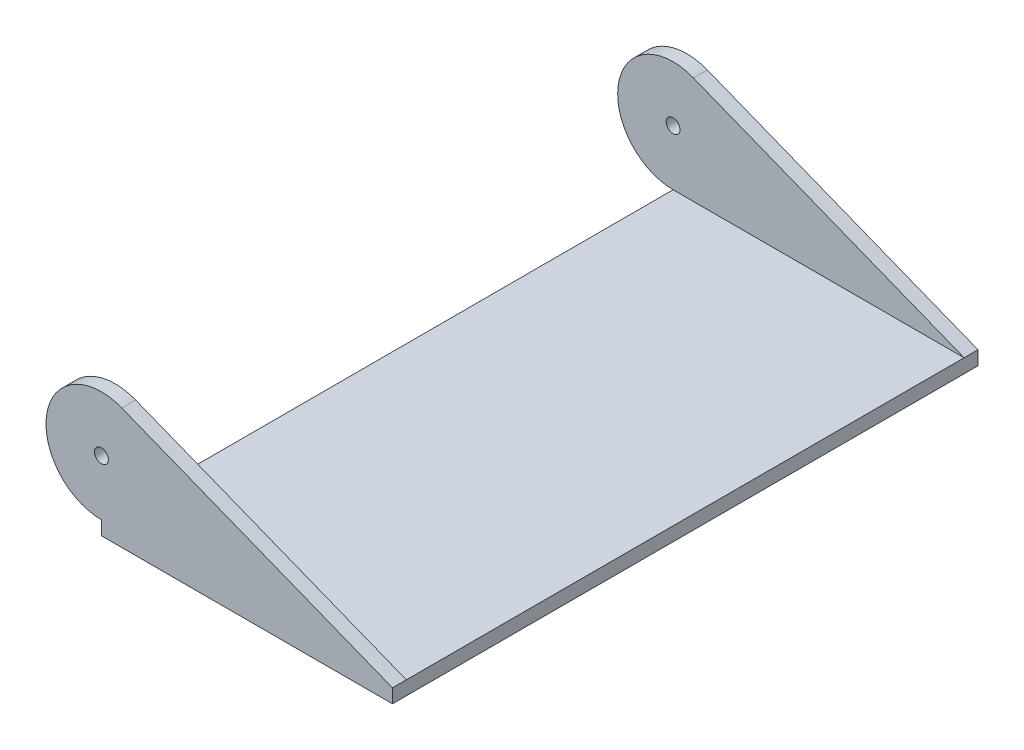
ISO-10303-21;
HEADER;
FILE_DESCRIPTION(('STEP AP214'),'2;1');
FILE_NAME('part.step','',(''),(''),'','','');
FILE_SCHEMA(('AUTOMOTIVE_DESIGN { 1 0 10303 214 1 1 1 1 }'));
ENDSEC;
DATA;
#1=APPLICATION_CONTEXT('core data for automotive mechanical design processes');
#2=APPLICATION_PROTOCOL_DEFINITION('international standard','automotive_design',2000,#1);
#3=PRODUCT_CONTEXT('',#1,'mechanical');
#4=PRODUCT('Part','Part','',(#3));
#5=PRODUCT_RELATED_PRODUCT_CATEGORY('part','',(#4));
#6=PRODUCT_DEFINITION_FORMATION('','',#4);
#7=PRODUCT_DEFINITION_CONTEXT('part definition',#1,'design');
#8=PRODUCT_DEFINITION('design','',#6,#7);
#9=PRODUCT_DEFINITION_SHAPE('','',#8);
#10=(LENGTH_UNIT() NAMED_UNIT(*) SI_UNIT(.MILLI.,.METRE.));
#11=(NAMED_UNIT(*) PLANE_ANGLE_UNIT() SI_UNIT($,.RADIAN.));
#12=(NAMED_UNIT(*) SI_UNIT($,.STERADIAN.) SOLID_ANGLE_UNIT());
#13=UNCERTAINTY_MEASURE_WITH_UNIT(LENGTH_MEASURE(1.E-05),#10,'distance_accuracy_value','');
#14=(GEOMETRIC_REPRESENTATION_CONTEXT(3) GLOBAL_UNCERTAINTY_ASSIGNED_CONTEXT((#13)) GLOBAL_UNIT_ASSIGNED_CONTEXT((#10,
#11,#12)) REPRESENTATION_CONTEXT('',''));
#15=CARTESIAN_POINT('',(0.,0.,0.));
#16=DIRECTION('',(0.,0.,1.));
#17=DIRECTION('',(1.,0.,0.));
#18=AXIS2_PLACEMENT_3D('',#15,#16,#17);
#19=CARTESIAN_POINT('',(1.63802124980249,4.14380375694082,-126.003723502117));
#20=DIRECTION('',(0.367614879649891,0.929978118161926,0.));
#21=DIRECTION('',(-0.929978118161926,0.367614879649891,0.));
#22=AXIS2_PLACEMENT_3D('',#19,#20,#21);
#23=PLANE('',#22);
#24=DIRECTION('',(0.929978118161926,-0.367614879649891,0.));
#25=VECTOR('',#24,1.);
#26=CARTESIAN_POINT('',(1.63802124980248,4.14380375694082,-18.8493634259259));
#27=LINE('',#26,#25);
#28=CARTESIAN_POINT('',(-22.8982844031121,13.8428610503282,-18.8493634259259));
#29=VERTEX_POINT('',#28);
#30=CARTESIAN_POINT('',(8.10486111111111,1.5875,-18.8493634259259));
#31=VERTEX_POINT('',#30);
#32=EDGE_CURVE('E135',#29,#31,#27,.T.);
#33=ORIENTED_EDGE('',*,*,#32,.F.);
#34=DIRECTION('',(0.,0.,1.));
#35=VECTOR('',#34,1.);
#36=CARTESIAN_POINT('',(-22.8982844031121,13.8428610503282,-126.003723502117));
#37=LINE('',#36,#35);
#38=CARTESIAN_POINT('',(-22.8982844031121,13.8428610503282,-17.2618634259259));
#39=VERTEX_POINT('',#38);
#40=EDGE_CURVE('E153',#29,#39,#37,.T.);
#41=ORIENTED_EDGE('',*,*,#40,.T.);
#42=DIRECTION('',(-0.929978118161926,0.367614879649891,0.));
#43=VECTOR('',#42,1.);
#44=CARTESIAN_POINT('',(1.63802124980249,4.14380375694082,-17.2618634259259));
#45=LINE('',#44,#43);
#46=CARTESIAN_POINT('',(8.10486111111111,1.5875,-17.2618634259259));
#47=VERTEX_POINT('',#46);
#48=EDGE_CURVE('E142',#47,#39,#45,.T.);
#49=ORIENTED_EDGE('',*,*,#48,.F.);
#50=DIRECTION('',(0.,0.,1.));
#51=VECTOR('',#50,1.);
#52=CARTESIAN_POINT('',(8.10486111111111,1.5875,-84.3337384259259));
#53=LINE('',#52,#51);
#54=EDGE_CURVE('E89',#31,#47,#53,.T.);
#55=ORIENTED_EDGE('',*,*,#54,.F.);
#56=EDGE_LOOP('',(#33,#41,#49,#55));
#57=FACE_BOUND('',#56,.T.);
#58=ADVANCED_FACE('F35',(#57),#23,.T.);
#59=CARTESIAN_POINT('',(-25.2326388888889,7.9375,-126.003723502117));
#60=DIRECTION('',(0.,0.,1.));
#61=DIRECTION('',(1.,0.,0.));
#62=AXIS2_PLACEMENT_3D('',#59,#60,#61);
#63=CYLINDRICAL_SURFACE('',#62,6.35);
#64=CARTESIAN_POINT('',(-25.2326388888889,7.9375,-18.8493634259259));
#65=DIRECTION('',(0.,0.,1.));
#66=DIRECTION('',(0.,-1.,0.));
#67=AXIS2_PLACEMENT_3D('',#64,#65,#66);
#68=CIRCLE('',#67,6.35);
#69=CARTESIAN_POINT('',(-25.2326388888889,1.5875,-18.8493634259259));
#70=VERTEX_POINT('',#69);
#71=EDGE_CURVE('E132',#70,#29,#68,.F.);
#72=ORIENTED_EDGE('',*,*,#71,.F.);
#73=DIRECTION('',(0.,0.,1.));
#74=VECTOR('',#73,1.);
#75=CARTESIAN_POINT('',(-25.2326388888889,1.5875,-84.3337384259259));
#76=LINE('',#75,#74);
#77=CARTESIAN_POINT('',(-25.2326388888889,1.5875,-17.2618634259259));
#78=VERTEX_POINT('',#77);
#79=EDGE_CURVE('E157',#70,#78,#76,.T.);
#80=ORIENTED_EDGE('',*,*,#79,.T.);
#81=CARTESIAN_POINT('',(-25.2326388888889,7.9375,-17.2618634259259));
#82=DIRECTION('',(0.,0.,1.));
#83=DIRECTION('',(1.,0.,0.));
#84=AXIS2_PLACEMENT_3D('',#81,#82,#83);
#85=CIRCLE('',#84,6.35);
#86=EDGE_CURVE('E101',#39,#78,#85,.T.);
#87=ORIENTED_EDGE('',*,*,#86,.F.);
#88=ORIENTED_EDGE('',*,*,#40,.F.);
#89=EDGE_LOOP('',(#72,#80,#87,#88));
#90=FACE_BOUND('',#89,.T.);
#91=ADVANCED_FACE('F200',(#90),#63,.T.);
#92=CARTESIAN_POINT('',(-25.2326388888889,7.9375,-126.003723502117));
#93=DIRECTION('',(0.,0.,1.));
#94=DIRECTION('',(1.,0.,0.));
#95=AXIS2_PLACEMENT_3D('',#92,#93,#94);
#96=CYLINDRICAL_SURFACE('',#95,0.793749999999999);
#97=CARTESIAN_POINT('',(-25.2326388888889,7.9375,-18.8493634259259));
#98=DIRECTION('',(0.,0.,1.));
#99=DIRECTION('',(0.,-1.,0.));
#100=AXIS2_PLACEMENT_3D('',#97,#98,#99);
#101=CIRCLE('',#100,0.793749999999999);
#102=CARTESIAN_POINT('',(-25.2326388888889,7.14375,-18.8493634259259));
#103=VERTEX_POINT('',#102);
#104=EDGE_CURVE('E39',#103,#103,#101,.F.);
#105=ORIENTED_EDGE('',*,*,#104,.T.);
#106=EDGE_LOOP('',(#105));
#107=FACE_BOUND('',#106,.T.);
#108=CARTESIAN_POINT('',(-25.2326388888889,7.9375,-17.2618634259259));
#109=DIRECTION('',(0.,0.,1.));
#110=DIRECTION('',(1.,0.,0.));
#111=AXIS2_PLACEMENT_3D('',#108,#109,#110);
#112=CIRCLE('',#111,0.793749999999999);
#113=CARTESIAN_POINT('',(-24.4388888888889,7.9375,-17.2618634259259));
#114=VERTEX_POINT('',#113);
#115=EDGE_CURVE('E139',#114,#114,#112,.T.);
#116=ORIENTED_EDGE('',*,*,#115,.T.);
#117=EDGE_LOOP('',(#116));
#118=FACE_BOUND('',#117,.T.);
#119=ADVANCED_FACE('F219',(#107,#118),#96,.F.);
#120=CARTESIAN_POINT('',(-25.2326388888889,1.5875,-84.3337384259259));
#121=DIRECTION('',(0.,0.,-1.));
#122=DIRECTION('',(-1.,0.,0.));
#123=AXIS2_PLACEMENT_3D('',#120,#121,#122);
#124=PLANE('',#123);
#125=DIRECTION('',(1.,0.,0.));
#126=VECTOR('',#125,1.);
#127=CARTESIAN_POINT('',(-25.2326388888889,0.,-84.3337384259259));
#128=LINE('',#127,#126);
#129=CARTESIAN_POINT('',(-25.2326388888889,0.,-84.3337384259259));
#130=VERTEX_POINT('',#129);
#131=CARTESIAN_POINT('',(8.10486111111111,0.,-84.3337384259259));
#132=VERTEX_POINT('',#131);
#133=EDGE_CURVE('E108',#130,#132,#128,.T.);
#134=ORIENTED_EDGE('',*,*,#133,.F.);
#135=DIRECTION('',(0.,-1.,0.));
#136=VECTOR('',#135,1.);
#137=CARTESIAN_POINT('',(-25.2326388888889,1.5875,-84.3337384259259));
#138=LINE('',#137,#136);
#139=CARTESIAN_POINT('',(-25.2326388888889,1.5875,-84.3337384259259));
#140=VERTEX_POINT('',#139);
#141=EDGE_CURVE('E11',#140,#130,#138,.T.);
#142=ORIENTED_EDGE('',*,*,#141,.F.);
#143=CARTESIAN_POINT('',(-25.2326388888889,7.9375,-84.3337384259259));
#144=DIRECTION('',(0.,0.,-1.));
#145=DIRECTION('',(-1.,0.,0.));
#146=AXIS2_PLACEMENT_3D('',#143,#144,#145);
#147=CIRCLE('',#146,6.35);
#148=CARTESIAN_POINT('',(-22.8982844031121,13.8428610503282,-84.3337384259259));
#149=VERTEX_POINT('',#148);
#150=EDGE_CURVE('E143',#149,#140,#147,.F.);
#151=ORIENTED_EDGE('',*,*,#150,.F.);
#152=DIRECTION('',(-0.929978118161926,0.367614879649891,0.));
#153=VECTOR('',#152,1.);
#154=CARTESIAN_POINT('',(1.63802124980249,4.14380375694082,-84.3337384259259));
#155=LINE('',#154,#153);
#156=CARTESIAN_POINT('',(8.10486111111111,1.5875,-84.3337384259259));
#157=VERTEX_POINT('',#156);
#158=EDGE_CURVE('E138',#157,#149,#155,.T.);
#159=ORIENTED_EDGE('',*,*,#158,.F.);
#160=DIRECTION('',(0.,-1.,0.));
#161=VECTOR('',#160,1.);
#162=CARTESIAN_POINT('',(8.10486111111111,1.5875,-84.3337384259259));
#163=LINE('',#162,#161);
#164=EDGE_CURVE('E113',#157,#132,#163,.T.);
#165=ORIENTED_EDGE('',*,*,#164,.T.);
#166=EDGE_LOOP('',(#134,#142,#151,#159,#165));
#167=FACE_BOUND('',#166,.T.);
#168=CARTESIAN_POINT('',(-25.2326388888889,7.9375,-84.3337384259259));
#169=DIRECTION('',(0.,0.,-1.));
#170=DIRECTION('',(-1.,0.,0.));
#171=AXIS2_PLACEMENT_3D('',#168,#169,#170);
#172=CIRCLE('',#171,0.793749999999999);
#173=CARTESIAN_POINT('',(-26.0263888888889,7.9375,-84.3337384259259));
#174=VERTEX_POINT('',#173);
#175=EDGE_CURVE('E145',#174,#174,#172,.F.);
#176=ORIENTED_EDGE('',*,*,#175,.T.);
#177=EDGE_LOOP('',(#176));
#178=FACE_BOUND('',#177,.T.);
#179=ADVANCED_FACE('F37',(#167,#178),#124,.T.);
#180=CARTESIAN_POINT('',(-25.2326388888889,1.5875,-84.3337384259259));
#181=DIRECTION('',(1.,0.,0.));
#182=DIRECTION('',(0.,0.,-1.));
#183=AXIS2_PLACEMENT_3D('',#180,#181,#182);
#184=PLANE('',#183);
#185=DIRECTION('',(0.,0.,1.));
#186=VECTOR('',#185,1.);
#187=CARTESIAN_POINT('',(-25.2326388888889,0.,-84.3337384259259));
#188=LINE('',#187,#186);
#189=CARTESIAN_POINT('',(-25.2326388888889,0.,-17.2618634259259));
#190=VERTEX_POINT('',#189);
#191=EDGE_CURVE('E78',#130,#190,#188,.T.);
#192=ORIENTED_EDGE('',*,*,#191,.T.);
#193=DIRECTION('',(0.,-1.,0.));
#194=VECTOR('',#193,1.);
#195=CARTESIAN_POINT('',(-25.2326388888889,1.5875,-17.2618634259259));
#196=LINE('',#195,#194);
#197=EDGE_CURVE('E44',#78,#190,#196,.T.);
#198=ORIENTED_EDGE('',*,*,#197,.F.);
#199=ORIENTED_EDGE('',*,*,#79,.F.);
#200=CARTESIAN_POINT('',(-25.2326388888889,1.5875,-82.7462384259259));
#201=VERTEX_POINT('',#200);
#202=EDGE_CURVE('E159',#201,#70,#76,.T.);
#203=ORIENTED_EDGE('',*,*,#202,.F.);
#204=EDGE_CURVE('E114',#140,#201,#76,.T.);
#205=ORIENTED_EDGE('',*,*,#204,.F.);
#206=ORIENTED_EDGE('',*,*,#141,.T.);
#207=EDGE_LOOP('',(#192,#198,#199,#203,#205,#206));
#208=FACE_BOUND('',#207,.T.);
#209=ADVANCED_FACE('F80',(#208),#184,.F.);
#210=CARTESIAN_POINT('',(-25.2326388888889,1.5875,-17.2618634259259));
#211=DIRECTION('',(0.,0.,-1.));
#212=DIRECTION('',(-1.,0.,0.));
#213=AXIS2_PLACEMENT_3D('',#210,#211,#212);
#214=PLANE('',#213);
#215=DIRECTION('',(1.,0.,0.));
#216=VECTOR('',#215,1.);
#217=CARTESIAN_POINT('',(-25.2326388888889,0.,-17.2618634259259));
#218=LINE('',#217,#216);
#219=CARTESIAN_POINT('',(8.10486111111111,0.,-17.2618634259259));
#220=VERTEX_POINT('',#219);
#221=EDGE_CURVE('E90',#190,#220,#218,.T.);
#222=ORIENTED_EDGE('',*,*,#221,.T.);
#223=DIRECTION('',(0.,-1.,0.));
#224=VECTOR('',#223,1.);
#225=CARTESIAN_POINT('',(8.10486111111111,1.5875,-17.2618634259259));
#226=LINE('',#225,#224);
#227=EDGE_CURVE('E102',#47,#220,#226,.T.);
#228=ORIENTED_EDGE('',*,*,#227,.F.);
#229=ORIENTED_EDGE('',*,*,#48,.T.);
#230=ORIENTED_EDGE('',*,*,#86,.T.);
#231=ORIENTED_EDGE('',*,*,#197,.T.);
#232=EDGE_LOOP('',(#222,#228,#229,#230,#231));
#233=FACE_BOUND('',#232,.T.);
#234=ORIENTED_EDGE('',*,*,#115,.F.);
#235=EDGE_LOOP('',(#234));
#236=FACE_BOUND('',#235,.T.);
#237=ADVANCED_FACE('F95',(#233,#236),#214,.F.);
#238=CARTESIAN_POINT('',(8.10486111111111,1.5875,-84.3337384259259));
#239=DIRECTION('',(1.,0.,0.));
#240=DIRECTION('',(0.,0.,-1.));
#241=AXIS2_PLACEMENT_3D('',#238,#239,#240);
#242=PLANE('',#241);
#243=DIRECTION('',(0.,0.,1.));
#244=VECTOR('',#243,1.);
#245=CARTESIAN_POINT('',(8.10486111111111,0.,-84.3337384259259));
#246=LINE('',#245,#244);
#247=EDGE_CURVE('E106',#132,#220,#246,.T.);
#248=ORIENTED_EDGE('',*,*,#247,.F.);
#249=ORIENTED_EDGE('',*,*,#164,.F.);
#250=CARTESIAN_POINT('',(8.10486111111111,1.5875,-82.7462384259259));
#251=VERTEX_POINT('',#250);
#252=EDGE_CURVE('E61',#157,#251,#53,.T.);
#253=ORIENTED_EDGE('',*,*,#252,.T.);
#254=DIRECTION('',(0.,0.,-1.));
#255=VECTOR('',#254,1.);
#256=CARTESIAN_POINT('',(8.10486111111111,1.5875,-18.8493634259259));
#257=LINE('',#256,#255);
#258=EDGE_CURVE('E127',#31,#251,#257,.T.);
#259=ORIENTED_EDGE('',*,*,#258,.F.);
#260=ORIENTED_EDGE('',*,*,#54,.T.);
#261=ORIENTED_EDGE('',*,*,#227,.T.);
#262=EDGE_LOOP('',(#248,#249,#253,#259,#260,#261));
#263=FACE_BOUND('',#262,.T.);
#264=ADVANCED_FACE('F166',(#263),#242,.T.);
#265=CARTESIAN_POINT('',(0.,0.,0.));
#266=DIRECTION('',(0.,-1.,0.));
#267=DIRECTION('',(0.,0.,-1.));
#268=AXIS2_PLACEMENT_3D('',#265,#266,#267);
#269=PLANE('',#268);
#270=ORIENTED_EDGE('',*,*,#133,.T.);
#271=ORIENTED_EDGE('',*,*,#247,.T.);
#272=ORIENTED_EDGE('',*,*,#221,.F.);
#273=ORIENTED_EDGE('',*,*,#191,.F.);
#274=EDGE_LOOP('',(#270,#271,#272,#273));
#275=FACE_BOUND('',#274,.T.);
#276=ADVANCED_FACE('F104',(#275),#269,.T.);
#277=DIRECTION('',(-0.929978118161926,0.367614879649891,0.));
#278=VECTOR('',#277,1.);
#279=CARTESIAN_POINT('',(1.63802124980249,4.14380375694082,-82.7462384259259));
#280=LINE('',#279,#278);
#281=CARTESIAN_POINT('',(-22.8982844031121,13.8428610503282,-82.7462384259259));
#282=VERTEX_POINT('',#281);
#283=EDGE_CURVE('E120',#251,#282,#280,.T.);
#284=ORIENTED_EDGE('',*,*,#283,.F.);
#285=ORIENTED_EDGE('',*,*,#252,.F.);
#286=ORIENTED_EDGE('',*,*,#158,.T.);
#287=EDGE_CURVE('E151',#149,#282,#37,.T.);
#288=ORIENTED_EDGE('',*,*,#287,.T.);
#289=EDGE_LOOP('',(#284,#285,#286,#288));
#290=FACE_BOUND('',#289,.T.);
#291=ADVANCED_FACE('F204',(#290),#23,.T.);
#292=ORIENTED_EDGE('',*,*,#204,.T.);
#293=CARTESIAN_POINT('',(-25.2326388888889,7.9375,-82.7462384259259));
#294=DIRECTION('',(0.,0.,-1.));
#295=DIRECTION('',(-1.,0.,0.));
#296=AXIS2_PLACEMENT_3D('',#293,#294,#295);
#297=CIRCLE('',#296,6.35);
#298=EDGE_CURVE('E52',#282,#201,#297,.F.);
#299=ORIENTED_EDGE('',*,*,#298,.F.);
#300=ORIENTED_EDGE('',*,*,#287,.F.);
#301=ORIENTED_EDGE('',*,*,#150,.T.);
#302=EDGE_LOOP('',(#292,#299,#300,#301));
#303=FACE_BOUND('',#302,.T.);
#304=ADVANCED_FACE('F202',(#303),#63,.T.);
#305=CARTESIAN_POINT('',(-25.2326388888889,7.9375,-82.7462384259259));
#306=DIRECTION('',(0.,0.,-1.));
#307=DIRECTION('',(-1.,0.,0.));
#308=AXIS2_PLACEMENT_3D('',#305,#306,#307);
#309=CIRCLE('',#308,0.793749999999999);
#310=CARTESIAN_POINT('',(-26.0263888888889,7.9375,-82.7462384259259));
#311=VERTEX_POINT('',#310);
#312=EDGE_CURVE('E115',#311,#311,#309,.F.);
#313=ORIENTED_EDGE('',*,*,#312,.T.);
#314=EDGE_LOOP('',(#313));
#315=FACE_BOUND('',#314,.T.);
#316=ORIENTED_EDGE('',*,*,#175,.F.);
#317=EDGE_LOOP('',(#316));
#318=FACE_BOUND('',#317,.T.);
#319=ADVANCED_FACE('F227',(#315,#318),#96,.F.);
#320=CARTESIAN_POINT('',(-31.5826388888889,1.5875,-18.8493634259259));
#321=DIRECTION('',(0.,-1.,0.));
#322=DIRECTION('',(0.,0.,-1.));
#323=AXIS2_PLACEMENT_3D('',#320,#321,#322);
#324=PLANE('',#323);
#325=DIRECTION('',(1.,0.,0.));
#326=VECTOR('',#325,1.);
#327=CARTESIAN_POINT('',(-31.5826388888889,1.5875,-18.8493634259259));
#328=LINE('',#327,#326);
#329=EDGE_CURVE('E122',#70,#31,#328,.T.);
#330=ORIENTED_EDGE('',*,*,#329,.T.);
#331=ORIENTED_EDGE('',*,*,#258,.T.);
#332=DIRECTION('',(1.,0.,0.));
#333=VECTOR('',#332,1.);
#334=CARTESIAN_POINT('',(-31.5826388888889,1.5875,-82.7462384259259));
#335=LINE('',#334,#333);
#336=EDGE_CURVE('E117',#201,#251,#335,.T.);
#337=ORIENTED_EDGE('',*,*,#336,.F.);
#338=ORIENTED_EDGE('',*,*,#202,.T.);
#339=EDGE_LOOP('',(#330,#331,#337,#338));
#340=FACE_BOUND('',#339,.T.);
#341=ADVANCED_FACE('F197',(#340),#324,.F.);
#342=CARTESIAN_POINT('',(-31.5826388888889,1.5875,-18.8493634259259));
#343=DIRECTION('',(0.,0.,1.));
#344=DIRECTION('',(0.,-1.,0.));
#345=AXIS2_PLACEMENT_3D('',#342,#343,#344);
#346=PLANE('',#345);
#347=ORIENTED_EDGE('',*,*,#32,.T.);
#348=ORIENTED_EDGE('',*,*,#329,.F.);
#349=ORIENTED_EDGE('',*,*,#71,.T.);
#350=EDGE_LOOP('',(#347,#348,#349));
#351=FACE_BOUND('',#350,.T.);
#352=ORIENTED_EDGE('',*,*,#104,.F.);
#353=EDGE_LOOP('',(#352));
#354=FACE_BOUND('',#353,.T.);
#355=ADVANCED_FACE('F191',(#351,#354),#346,.F.);
#356=CARTESIAN_POINT('',(-31.5826388888889,1.5875,-82.7462384259259));
#357=DIRECTION('',(0.,0.,-1.));
#358=DIRECTION('',(-1.,0.,0.));
#359=AXIS2_PLACEMENT_3D('',#356,#357,#358);
#360=PLANE('',#359);
#361=ORIENTED_EDGE('',*,*,#283,.T.);
#362=ORIENTED_EDGE('',*,*,#298,.T.);
#363=ORIENTED_EDGE('',*,*,#336,.T.);
#364=EDGE_LOOP('',(#361,#362,#363));
#365=FACE_BOUND('',#364,.T.);
#366=ORIENTED_EDGE('',*,*,#312,.F.);
#367=EDGE_LOOP('',(#366));
#368=FACE_BOUND('',#367,.T.);
#369=ADVANCED_FACE('F205',(#365,#368),#360,.F.);
#370=CLOSED_SHELL('',(#58,#91,#119,#179,#209,#237,#264,#276,#291,#304,#319,#341,#355,#369));
#371=MANIFOLD_SOLID_BREP('B2',#370);
#372=ADVANCED_BREP_SHAPE_REPRESENTATION('',(#18,#371),#14);
#373=SHAPE_DEFINITION_REPRESENTATION(#9,#372);
ENDSEC;
END-ISO-10303-21;
